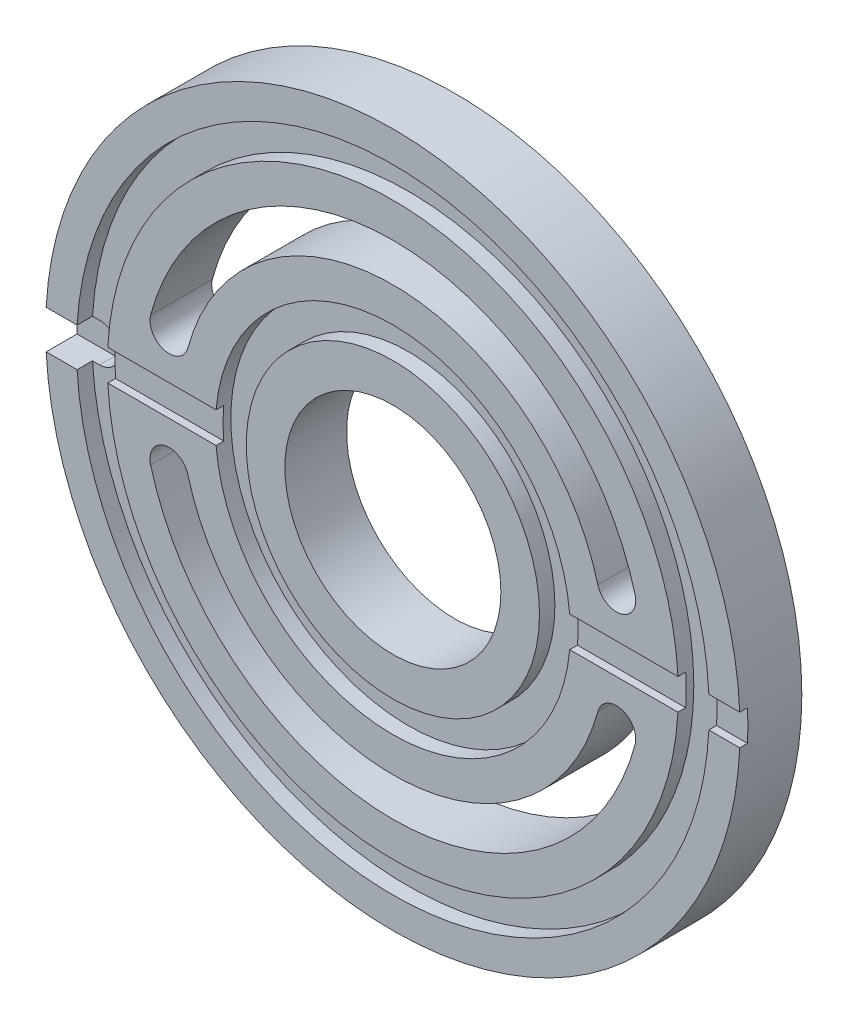
ISO-10303-21;
HEADER;
FILE_DESCRIPTION(('STEP AP214'),'2;1');
FILE_NAME('part.step','',(''),(''),'','','');
FILE_SCHEMA(('AUTOMOTIVE_DESIGN { 1 0 10303 214 1 1 1 1 }'));
ENDSEC;
DATA;
#1=APPLICATION_CONTEXT('core data for automotive mechanical design processes');
#2=APPLICATION_PROTOCOL_DEFINITION('international standard','automotive_design',2000,#1);
#3=PRODUCT_CONTEXT('',#1,'mechanical');
#4=PRODUCT('Part','Part','',(#3));
#5=PRODUCT_RELATED_PRODUCT_CATEGORY('part','',(#4));
#6=PRODUCT_DEFINITION_FORMATION('','',#4);
#7=PRODUCT_DEFINITION_CONTEXT('part definition',#1,'design');
#8=PRODUCT_DEFINITION('design','',#6,#7);
#9=PRODUCT_DEFINITION_SHAPE('','',#8);
#10=(LENGTH_UNIT() NAMED_UNIT(*) SI_UNIT(.MILLI.,.METRE.));
#11=(NAMED_UNIT(*) PLANE_ANGLE_UNIT() SI_UNIT($,.RADIAN.));
#12=(NAMED_UNIT(*) SI_UNIT($,.STERADIAN.) SOLID_ANGLE_UNIT());
#13=UNCERTAINTY_MEASURE_WITH_UNIT(LENGTH_MEASURE(1.E-05),#10,'distance_accuracy_value','');
#14=(GEOMETRIC_REPRESENTATION_CONTEXT(3) GLOBAL_UNCERTAINTY_ASSIGNED_CONTEXT((#13)) GLOBAL_UNIT_ASSIGNED_CONTEXT((#10,
#11,#12)) REPRESENTATION_CONTEXT('',''));
#15=CARTESIAN_POINT('',(0.,0.,0.));
#16=DIRECTION('',(0.,0.,1.));
#17=DIRECTION('',(1.,0.,0.));
#18=AXIS2_PLACEMENT_3D('',#15,#16,#17);
#19=CARTESIAN_POINT('',(0.,0.,8.));
#20=DIRECTION('',(0.,0.,1.));
#21=DIRECTION('',(1.,0.,0.));
#22=AXIS2_PLACEMENT_3D('',#19,#20,#21);
#23=PLANE('',#22);
#24=CARTESIAN_POINT('',(0.,0.,8.));
#25=DIRECTION('',(0.,0.,1.));
#26=DIRECTION('',(1.,0.,0.));
#27=AXIS2_PLACEMENT_3D('',#24,#25,#26);
#28=CIRCLE('',#27,27.5);
#29=CARTESIAN_POINT('',(-26.5629602229494,-7.11752374031915,8.));
#30=VERTEX_POINT('',#29);
#31=CARTESIAN_POINT('',(26.5629602229494,-7.11752374031915,8.));
#32=VERTEX_POINT('',#31);
#33=EDGE_CURVE('E292',#30,#32,#28,.T.);
#34=ORIENTED_EDGE('',*,*,#33,.T.);
#35=CARTESIAN_POINT('',(28.9777747886721,-7.76457135307544,8.));
#36=DIRECTION('',(0.,0.,-1.));
#37=DIRECTION('',(-1.,0.,0.));
#38=AXIS2_PLACEMENT_3D('',#35,#36,#37);
#39=CIRCLE('',#38,2.5);
#40=CARTESIAN_POINT('',(31.3925893543948,-8.41161896583172,8.));
#41=VERTEX_POINT('',#40);
#42=EDGE_CURVE('E288',#32,#41,#39,.T.);
#43=ORIENTED_EDGE('',*,*,#42,.T.);
#44=CARTESIAN_POINT('',(0.,0.,8.));
#45=DIRECTION('',(0.,0.,-1.));
#46=DIRECTION('',(1.,0.,0.));
#47=AXIS2_PLACEMENT_3D('',#44,#45,#46);
#48=CIRCLE('',#47,32.5);
#49=CARTESIAN_POINT('',(-31.3925893543948,-8.41161896583172,8.));
#50=VERTEX_POINT('',#49);
#51=EDGE_CURVE('E277',#41,#50,#48,.T.);
#52=ORIENTED_EDGE('',*,*,#51,.T.);
#53=CARTESIAN_POINT('',(-28.9777747886721,-7.76457135307544,8.));
#54=DIRECTION('',(0.,0.,-1.));
#55=DIRECTION('',(1.,0.,0.));
#56=AXIS2_PLACEMENT_3D('',#53,#54,#55);
#57=CIRCLE('',#56,2.5);
#58=EDGE_CURVE('E296',#50,#30,#57,.T.);
#59=ORIENTED_EDGE('',*,*,#58,.T.);
#60=EDGE_LOOP('',(#34,#43,#52,#59));
#61=FACE_BOUND('',#60,.T.);
#62=CARTESIAN_POINT('',(0.,0.,8.));
#63=DIRECTION('',(0.,0.,1.));
#64=DIRECTION('',(1.,0.,0.));
#65=AXIS2_PLACEMENT_3D('',#62,#63,#64);
#66=CIRCLE('',#65,23.);
#67=CARTESIAN_POINT('',(-22.9128784747792,-2.,8.));
#68=VERTEX_POINT('',#67);
#69=CARTESIAN_POINT('',(22.9128784747792,-2.,8.));
#70=VERTEX_POINT('',#69);
#71=EDGE_CURVE('E249',#68,#70,#66,.T.);
#72=ORIENTED_EDGE('',*,*,#71,.F.);
#73=DIRECTION('',(1.,0.,0.));
#74=VECTOR('',#73,1.);
#75=CARTESIAN_POINT('',(-19.,-2.,8.));
#76=LINE('',#75,#74);
#77=CARTESIAN_POINT('',(-36.9459064038223,-2.,8.));
#78=VERTEX_POINT('',#77);
#79=EDGE_CURVE('E454',#68,#78,#76,.F.);
#80=ORIENTED_EDGE('',*,*,#79,.T.);
#81=CARTESIAN_POINT('',(0.,0.,8.));
#82=DIRECTION('',(0.,0.,1.));
#83=DIRECTION('',(1.,0.,0.));
#84=AXIS2_PLACEMENT_3D('',#81,#82,#83);
#85=CIRCLE('',#84,37.);
#86=CARTESIAN_POINT('',(36.9459064038223,-2.,8.));
#87=VERTEX_POINT('',#86);
#88=EDGE_CURVE('E251',#78,#87,#85,.T.);
#89=ORIENTED_EDGE('',*,*,#88,.T.);
#90=DIRECTION('',(1.,0.,0.));
#91=VECTOR('',#90,1.);
#92=CARTESIAN_POINT('',(19.,-2.,8.));
#93=LINE('',#92,#91);
#94=EDGE_CURVE('E235',#70,#87,#93,.T.);
#95=ORIENTED_EDGE('',*,*,#94,.F.);
#96=EDGE_LOOP('',(#72,#80,#89,#95));
#97=FACE_BOUND('',#96,.T.);
#98=ADVANCED_FACE('F58',(#61,#97),#23,.T.);
#99=CARTESIAN_POINT('',(0.,0.,8.));
#100=DIRECTION('',(0.,0.,1.));
#101=DIRECTION('',(1.,0.,0.));
#102=AXIS2_PLACEMENT_3D('',#99,#100,#101);
#103=CIRCLE('',#102,41.);
#104=CARTESIAN_POINT('',(40.9511904588865,2.,8.));
#105=VERTEX_POINT('',#104);
#106=CARTESIAN_POINT('',(-40.9237095092808,2.5,8.));
#107=VERTEX_POINT('',#106);
#108=EDGE_CURVE('E406',#105,#107,#103,.T.);
#109=ORIENTED_EDGE('',*,*,#108,.F.);
#110=DIRECTION('',(1.,0.,0.));
#111=VECTOR('',#110,1.);
#112=CARTESIAN_POINT('',(19.,2.,8.));
#113=LINE('',#112,#111);
#114=CARTESIAN_POINT('',(44.9555335859781,2.,8.));
#115=VERTEX_POINT('',#114);
#116=EDGE_CURVE('E253',#105,#115,#113,.T.);
#117=ORIENTED_EDGE('',*,*,#116,.T.);
#118=CARTESIAN_POINT('',(0.,0.,8.));
#119=DIRECTION('',(0.,0.,1.));
#120=DIRECTION('',(1.,0.,0.));
#121=AXIS2_PLACEMENT_3D('',#118,#119,#120);
#122=CIRCLE('',#121,45.);
#123=CARTESIAN_POINT('',(-44.9305018890286,2.5,8.));
#124=VERTEX_POINT('',#123);
#125=EDGE_CURVE('E433',#115,#124,#122,.T.);
#126=ORIENTED_EDGE('',*,*,#125,.T.);
#127=DIRECTION('',(-1.,0.,0.));
#128=VECTOR('',#127,1.);
#129=CARTESIAN_POINT('',(-45.,2.5,8.));
#130=LINE('',#129,#128);
#131=EDGE_CURVE('E365',#107,#124,#130,.T.);
#132=ORIENTED_EDGE('',*,*,#131,.F.);
#133=EDGE_LOOP('',(#109,#117,#126,#132));
#134=FACE_BOUND('',#133,.T.);
#135=ADVANCED_FACE('F521',(#134),#23,.T.);
#136=CARTESIAN_POINT('',(0.,0.,8.));
#137=DIRECTION('',(0.,0.,1.));
#138=DIRECTION('',(1.,0.,0.));
#139=AXIS2_PLACEMENT_3D('',#136,#137,#138);
#140=CIRCLE('',#139,14.);
#141=CARTESIAN_POINT('',(14.,0.,8.));
#142=VERTEX_POINT('',#141);
#143=EDGE_CURVE('E415',#142,#142,#140,.T.);
#144=ORIENTED_EDGE('',*,*,#143,.F.);
#145=EDGE_LOOP('',(#144));
#146=FACE_BOUND('',#145,.T.);
#147=CARTESIAN_POINT('',(0.,0.,8.));
#148=DIRECTION('',(0.,0.,1.));
#149=DIRECTION('',(1.,0.,0.));
#150=AXIS2_PLACEMENT_3D('',#147,#148,#149);
#151=CIRCLE('',#150,19.);
#152=CARTESIAN_POINT('',(19.,0.,8.));
#153=VERTEX_POINT('',#152);
#154=EDGE_CURVE('E268',#153,#153,#151,.T.);
#155=ORIENTED_EDGE('',*,*,#154,.T.);
#156=EDGE_LOOP('',(#155));
#157=FACE_BOUND('',#156,.T.);
#158=ADVANCED_FACE('F500',(#146,#157),#23,.T.);
#159=DIRECTION('',(1.,0.,0.));
#160=VECTOR('',#159,1.);
#161=CARTESIAN_POINT('',(-19.,2.,8.));
#162=LINE('',#161,#160);
#163=CARTESIAN_POINT('',(-22.9128784747792,2.,8.));
#164=VERTEX_POINT('',#163);
#165=CARTESIAN_POINT('',(-36.9459064038223,2.,8.));
#166=VERTEX_POINT('',#165);
#167=EDGE_CURVE('E555',#164,#166,#162,.F.);
#168=ORIENTED_EDGE('',*,*,#167,.F.);
#169=CARTESIAN_POINT('',(22.9128784747792,2.,8.));
#170=VERTEX_POINT('',#169);
#171=EDGE_CURVE('E261',#170,#164,#66,.T.);
#172=ORIENTED_EDGE('',*,*,#171,.F.);
#173=CARTESIAN_POINT('',(36.9459064038223,2.,8.));
#174=VERTEX_POINT('',#173);
#175=EDGE_CURVE('E628',#170,#174,#113,.T.);
#176=ORIENTED_EDGE('',*,*,#175,.T.);
#177=EDGE_CURVE('E407',#174,#166,#85,.T.);
#178=ORIENTED_EDGE('',*,*,#177,.T.);
#179=EDGE_LOOP('',(#168,#172,#176,#178));
#180=FACE_BOUND('',#179,.T.);
#181=CARTESIAN_POINT('',(28.9777747886721,7.76457135307544,8.));
#182=DIRECTION('',(0.,0.,1.));
#183=DIRECTION('',(-1.,0.,0.));
#184=AXIS2_PLACEMENT_3D('',#181,#182,#183);
#185=CIRCLE('',#184,2.5);
#186=CARTESIAN_POINT('',(26.5629602229494,7.11752374031915,8.));
#187=VERTEX_POINT('',#186);
#188=CARTESIAN_POINT('',(31.3925893543948,8.41161896583172,8.));
#189=VERTEX_POINT('',#188);
#190=EDGE_CURVE('E307',#187,#189,#185,.T.);
#191=ORIENTED_EDGE('',*,*,#190,.F.);
#192=CARTESIAN_POINT('',(0.,0.,8.));
#193=DIRECTION('',(0.,0.,-1.));
#194=DIRECTION('',(1.,0.,0.));
#195=AXIS2_PLACEMENT_3D('',#192,#193,#194);
#196=CIRCLE('',#195,27.5);
#197=CARTESIAN_POINT('',(-26.5629602229494,7.11752374031915,8.));
#198=VERTEX_POINT('',#197);
#199=EDGE_CURVE('E322',#198,#187,#196,.T.);
#200=ORIENTED_EDGE('',*,*,#199,.F.);
#201=CARTESIAN_POINT('',(-28.9777747886721,7.76457135307544,8.));
#202=DIRECTION('',(0.,0.,1.));
#203=DIRECTION('',(1.,0.,0.));
#204=AXIS2_PLACEMENT_3D('',#201,#202,#203);
#205=CIRCLE('',#204,2.5);
#206=CARTESIAN_POINT('',(-31.3925893543948,8.41161896583172,8.));
#207=VERTEX_POINT('',#206);
#208=EDGE_CURVE('E341',#207,#198,#205,.T.);
#209=ORIENTED_EDGE('',*,*,#208,.F.);
#210=CARTESIAN_POINT('',(0.,0.,8.));
#211=DIRECTION('',(0.,0.,1.));
#212=DIRECTION('',(1.,0.,0.));
#213=AXIS2_PLACEMENT_3D('',#210,#211,#212);
#214=CIRCLE('',#213,32.5);
#215=EDGE_CURVE('E337',#189,#207,#214,.T.);
#216=ORIENTED_EDGE('',*,*,#215,.F.);
#217=EDGE_LOOP('',(#191,#200,#209,#216));
#218=FACE_BOUND('',#217,.T.);
#219=ADVANCED_FACE('F533',(#180,#218),#23,.T.);
#220=CARTESIAN_POINT('',(0.,0.,0.));
#221=DIRECTION('',(0.,0.,1.));
#222=DIRECTION('',(1.,0.,0.));
#223=AXIS2_PLACEMENT_3D('',#220,#221,#222);
#224=PLANE('',#223);
#225=CARTESIAN_POINT('',(0.,0.,0.));
#226=DIRECTION('',(0.,0.,1.));
#227=DIRECTION('',(1.,0.,0.));
#228=AXIS2_PLACEMENT_3D('',#225,#226,#227);
#229=CIRCLE('',#228,45.);
#230=CARTESIAN_POINT('',(45.,0.,0.));
#231=VERTEX_POINT('',#230);
#232=EDGE_CURVE('E424',#231,#231,#229,.T.);
#233=ORIENTED_EDGE('',*,*,#232,.F.);
#234=EDGE_LOOP('',(#233));
#235=FACE_BOUND('',#234,.T.);
#236=CARTESIAN_POINT('',(0.,0.,0.));
#237=DIRECTION('',(0.,0.,1.));
#238=DIRECTION('',(1.,0.,0.));
#239=AXIS2_PLACEMENT_3D('',#236,#237,#238);
#240=CIRCLE('',#239,14.);
#241=CARTESIAN_POINT('',(14.,0.,0.));
#242=VERTEX_POINT('',#241);
#243=EDGE_CURVE('E420',#242,#242,#240,.T.);
#244=ORIENTED_EDGE('',*,*,#243,.T.);
#245=EDGE_LOOP('',(#244));
#246=FACE_BOUND('',#245,.T.);
#247=CARTESIAN_POINT('',(0.,0.,0.));
#248=DIRECTION('',(0.,0.,-1.));
#249=DIRECTION('',(1.,0.,0.));
#250=AXIS2_PLACEMENT_3D('',#247,#248,#249);
#251=CIRCLE('',#250,27.5);
#252=CARTESIAN_POINT('',(-26.5629602229494,7.11752374031915,0.));
#253=VERTEX_POINT('',#252);
#254=CARTESIAN_POINT('',(26.5629602229494,7.11752374031915,0.));
#255=VERTEX_POINT('',#254);
#256=EDGE_CURVE('E330',#253,#255,#251,.T.);
#257=ORIENTED_EDGE('',*,*,#256,.T.);
#258=CARTESIAN_POINT('',(28.9777747886721,7.76457135307544,0.));
#259=DIRECTION('',(0.,0.,1.));
#260=DIRECTION('',(-1.,0.,0.));
#261=AXIS2_PLACEMENT_3D('',#258,#259,#260);
#262=CIRCLE('',#261,2.5);
#263=CARTESIAN_POINT('',(31.3925893543948,8.41161896583172,0.));
#264=VERTEX_POINT('',#263);
#265=EDGE_CURVE('E317',#255,#264,#262,.T.);
#266=ORIENTED_EDGE('',*,*,#265,.T.);
#267=CARTESIAN_POINT('',(0.,0.,0.));
#268=DIRECTION('',(0.,0.,1.));
#269=DIRECTION('',(1.,0.,0.));
#270=AXIS2_PLACEMENT_3D('',#267,#268,#269);
#271=CIRCLE('',#270,32.5);
#272=CARTESIAN_POINT('',(-31.3925893543948,8.41161896583172,0.));
#273=VERTEX_POINT('',#272);
#274=EDGE_CURVE('E321',#264,#273,#271,.T.);
#275=ORIENTED_EDGE('',*,*,#274,.T.);
#276=CARTESIAN_POINT('',(-28.9777747886721,7.76457135307544,0.));
#277=DIRECTION('',(0.,0.,1.));
#278=DIRECTION('',(1.,0.,0.));
#279=AXIS2_PLACEMENT_3D('',#276,#277,#278);
#280=CIRCLE('',#279,2.5);
#281=EDGE_CURVE('E326',#273,#253,#280,.T.);
#282=ORIENTED_EDGE('',*,*,#281,.T.);
#283=EDGE_LOOP('',(#257,#266,#275,#282));
#284=FACE_BOUND('',#283,.T.);
#285=CARTESIAN_POINT('',(28.9777747886721,-7.76457135307544,0.));
#286=DIRECTION('',(0.,0.,-1.));
#287=DIRECTION('',(-1.,0.,0.));
#288=AXIS2_PLACEMENT_3D('',#285,#286,#287);
#289=CIRCLE('',#288,2.5);
#290=CARTESIAN_POINT('',(26.5629602229494,-7.11752374031915,0.));
#291=VERTEX_POINT('',#290);
#292=CARTESIAN_POINT('',(31.3925893543948,-8.41161896583172,0.));
#293=VERTEX_POINT('',#292);
#294=EDGE_CURVE('E273',#291,#293,#289,.T.);
#295=ORIENTED_EDGE('',*,*,#294,.F.);
#296=CARTESIAN_POINT('',(0.,0.,0.));
#297=DIRECTION('',(0.,0.,1.));
#298=DIRECTION('',(1.,0.,0.));
#299=AXIS2_PLACEMENT_3D('',#296,#297,#298);
#300=CIRCLE('',#299,27.5);
#301=CARTESIAN_POINT('',(-26.5629602229494,-7.11752374031915,0.));
#302=VERTEX_POINT('',#301);
#303=EDGE_CURVE('E276',#302,#291,#300,.T.);
#304=ORIENTED_EDGE('',*,*,#303,.F.);
#305=CARTESIAN_POINT('',(-28.9777747886721,-7.76457135307544,0.));
#306=DIRECTION('',(0.,0.,-1.));
#307=DIRECTION('',(1.,0.,0.));
#308=AXIS2_PLACEMENT_3D('',#305,#306,#307);
#309=CIRCLE('',#308,2.5);
#310=CARTESIAN_POINT('',(-31.3925893543948,-8.41161896583172,0.));
#311=VERTEX_POINT('',#310);
#312=EDGE_CURVE('E280',#311,#302,#309,.T.);
#313=ORIENTED_EDGE('',*,*,#312,.F.);
#314=CARTESIAN_POINT('',(0.,0.,0.));
#315=DIRECTION('',(0.,0.,-1.));
#316=DIRECTION('',(1.,0.,0.));
#317=AXIS2_PLACEMENT_3D('',#314,#315,#316);
#318=CIRCLE('',#317,32.5);
#319=EDGE_CURVE('E284',#293,#311,#318,.T.);
#320=ORIENTED_EDGE('',*,*,#319,.F.);
#321=EDGE_LOOP('',(#295,#304,#313,#320));
#322=FACE_BOUND('',#321,.T.);
#323=ADVANCED_FACE('F541',(#235,#246,#284,#322),#224,.F.);
#324=CARTESIAN_POINT('',(0.,0.,8.));
#325=DIRECTION('',(0.,0.,-1.));
#326=DIRECTION('',(-1.,0.,0.));
#327=AXIS2_PLACEMENT_3D('',#324,#325,#326);
#328=CYLINDRICAL_SURFACE('',#327,45.);
#329=CARTESIAN_POINT('',(0.,0.,7.));
#330=DIRECTION('',(0.,0.,-1.));
#331=DIRECTION('',(-1.,0.,0.));
#332=AXIS2_PLACEMENT_3D('',#329,#330,#331);
#333=CIRCLE('',#332,45.);
#334=CARTESIAN_POINT('',(44.9555335859781,2.,7.));
#335=VERTEX_POINT('',#334);
#336=CARTESIAN_POINT('',(44.9555335859781,-2.,7.));
#337=VERTEX_POINT('',#336);
#338=EDGE_CURVE('E460',#335,#337,#333,.T.);
#339=ORIENTED_EDGE('',*,*,#338,.T.);
#340=DIRECTION('',(0.,0.,-1.));
#341=VECTOR('',#340,1.);
#342=CARTESIAN_POINT('',(44.9555335859781,-2.,8.));
#343=LINE('',#342,#341);
#344=CARTESIAN_POINT('',(44.9555335859781,-2.,8.));
#345=VERTEX_POINT('',#344);
#346=EDGE_CURVE('E486',#337,#345,#343,.F.);
#347=ORIENTED_EDGE('',*,*,#346,.T.);
#348=CARTESIAN_POINT('',(-44.9305018890286,-2.5,8.));
#349=VERTEX_POINT('',#348);
#350=EDGE_CURVE('E428',#349,#345,#122,.T.);
#351=ORIENTED_EDGE('',*,*,#350,.F.);
#352=DIRECTION('',(0.,0.,-1.));
#353=VECTOR('',#352,1.);
#354=CARTESIAN_POINT('',(-44.9305018890286,-2.5,8.));
#355=LINE('',#354,#353);
#356=CARTESIAN_POINT('',(-44.9305018890286,-2.5,4.));
#357=VERTEX_POINT('',#356);
#358=EDGE_CURVE('E390',#349,#357,#355,.T.);
#359=ORIENTED_EDGE('',*,*,#358,.T.);
#360=CARTESIAN_POINT('',(0.,0.,4.));
#361=DIRECTION('',(0.,0.,1.));
#362=DIRECTION('',(1.,0.,0.));
#363=AXIS2_PLACEMENT_3D('',#360,#361,#362);
#364=CIRCLE('',#363,45.);
#365=CARTESIAN_POINT('',(-44.9305018890286,2.5,4.));
#366=VERTEX_POINT('',#365);
#367=EDGE_CURVE('E445',#366,#357,#364,.T.);
#368=ORIENTED_EDGE('',*,*,#367,.F.);
#369=DIRECTION('',(0.,0.,-1.));
#370=VECTOR('',#369,1.);
#371=CARTESIAN_POINT('',(-44.9305018890286,2.5,8.));
#372=LINE('',#371,#370);
#373=EDGE_CURVE('E398',#366,#124,#372,.F.);
#374=ORIENTED_EDGE('',*,*,#373,.T.);
#375=ORIENTED_EDGE('',*,*,#125,.F.);
#376=DIRECTION('',(0.,0.,-1.));
#377=VECTOR('',#376,1.);
#378=CARTESIAN_POINT('',(44.9555335859781,2.,8.));
#379=LINE('',#378,#377);
#380=EDGE_CURVE('E476',#335,#115,#379,.F.);
#381=ORIENTED_EDGE('',*,*,#380,.F.);
#382=EDGE_LOOP('',(#339,#347,#351,#359,#368,#374,#375,#381));
#383=FACE_BOUND('',#382,.T.);
#384=ORIENTED_EDGE('',*,*,#232,.T.);
#385=EDGE_LOOP('',(#384));
#386=FACE_BOUND('',#385,.T.);
#387=ADVANCED_FACE('F60',(#383,#386),#328,.T.);
#388=CARTESIAN_POINT('',(40.9511904588865,-2.,8.));
#389=VERTEX_POINT('',#388);
#390=EDGE_CURVE('E254',#389,#345,#93,.T.);
#391=ORIENTED_EDGE('',*,*,#390,.F.);
#392=CARTESIAN_POINT('',(-40.9237095092808,-2.5,8.));
#393=VERTEX_POINT('',#392);
#394=EDGE_CURVE('E416',#393,#389,#103,.T.);
#395=ORIENTED_EDGE('',*,*,#394,.F.);
#396=DIRECTION('',(1.,0.,0.));
#397=VECTOR('',#396,1.);
#398=CARTESIAN_POINT('',(-45.,-2.5,8.));
#399=LINE('',#398,#397);
#400=EDGE_CURVE('E351',#349,#393,#399,.T.);
#401=ORIENTED_EDGE('',*,*,#400,.F.);
#402=ORIENTED_EDGE('',*,*,#350,.T.);
#403=EDGE_LOOP('',(#391,#395,#401,#402));
#404=FACE_BOUND('',#403,.T.);
#405=ADVANCED_FACE('F524',(#404),#23,.T.);
#406=CARTESIAN_POINT('',(0.,0.,0.));
#407=DIRECTION('',(0.,0.,1.));
#408=DIRECTION('',(1.,0.,0.));
#409=AXIS2_PLACEMENT_3D('',#406,#407,#408);
#410=CYLINDRICAL_SURFACE('',#409,14.);
#411=ORIENTED_EDGE('',*,*,#243,.F.);
#412=EDGE_LOOP('',(#411));
#413=FACE_BOUND('',#412,.T.);
#414=ORIENTED_EDGE('',*,*,#143,.T.);
#415=EDGE_LOOP('',(#414));
#416=FACE_BOUND('',#415,.T.);
#417=ADVANCED_FACE('F531',(#413,#416),#410,.F.);
#418=CARTESIAN_POINT('',(0.,0.,6.));
#419=DIRECTION('',(0.,0.,1.));
#420=DIRECTION('',(1.,0.,0.));
#421=AXIS2_PLACEMENT_3D('',#418,#419,#420);
#422=CYLINDRICAL_SURFACE('',#421,41.);
#423=ORIENTED_EDGE('',*,*,#394,.T.);
#424=DIRECTION('',(0.,0.,1.));
#425=VECTOR('',#424,1.);
#426=CARTESIAN_POINT('',(40.9511904588865,-2.,6.));
#427=LINE('',#426,#425);
#428=CARTESIAN_POINT('',(40.9511904588865,-2.,7.));
#429=VERTEX_POINT('',#428);
#430=EDGE_CURVE('E482',#389,#429,#427,.F.);
#431=ORIENTED_EDGE('',*,*,#430,.T.);
#432=CARTESIAN_POINT('',(0.,0.,7.));
#433=DIRECTION('',(0.,0.,-1.));
#434=DIRECTION('',(-1.,0.,0.));
#435=AXIS2_PLACEMENT_3D('',#432,#433,#434);
#436=CIRCLE('',#435,41.);
#437=CARTESIAN_POINT('',(40.9511904588865,2.,7.));
#438=VERTEX_POINT('',#437);
#439=EDGE_CURVE('E466',#429,#438,#436,.F.);
#440=ORIENTED_EDGE('',*,*,#439,.T.);
#441=DIRECTION('',(0.,0.,1.));
#442=VECTOR('',#441,1.);
#443=CARTESIAN_POINT('',(40.9511904588865,2.,6.));
#444=LINE('',#443,#442);
#445=EDGE_CURVE('E473',#105,#438,#444,.F.);
#446=ORIENTED_EDGE('',*,*,#445,.F.);
#447=ORIENTED_EDGE('',*,*,#108,.T.);
#448=DIRECTION('',(0.,0.,1.));
#449=VECTOR('',#448,1.);
#450=CARTESIAN_POINT('',(-40.9237095092808,2.5,6.));
#451=LINE('',#450,#449);
#452=CARTESIAN_POINT('',(-40.9237095092808,2.5,6.));
#453=VERTEX_POINT('',#452);
#454=EDGE_CURVE('E394',#107,#453,#451,.F.);
#455=ORIENTED_EDGE('',*,*,#454,.T.);
#456=CARTESIAN_POINT('',(0.,0.,6.));
#457=DIRECTION('',(0.,0.,1.));
#458=DIRECTION('',(1.,0.,0.));
#459=AXIS2_PLACEMENT_3D('',#456,#457,#458);
#460=CIRCLE('',#459,41.);
#461=CARTESIAN_POINT('',(-40.9237095092808,-2.5,6.));
#462=VERTEX_POINT('',#461);
#463=EDGE_CURVE('E411',#462,#453,#460,.T.);
#464=ORIENTED_EDGE('',*,*,#463,.F.);
#465=DIRECTION('',(0.,0.,1.));
#466=VECTOR('',#465,1.);
#467=CARTESIAN_POINT('',(-40.9237095092808,-2.5,6.));
#468=LINE('',#467,#466);
#469=EDGE_CURVE('E383',#462,#393,#468,.T.);
#470=ORIENTED_EDGE('',*,*,#469,.T.);
#471=EDGE_LOOP('',(#423,#431,#440,#446,#447,#455,#464,#470));
#472=FACE_BOUND('',#471,.T.);
#473=ADVANCED_FACE('F539',(#472),#422,.F.);
#474=CARTESIAN_POINT('',(0.,0.,6.));
#475=DIRECTION('',(0.,0.,1.));
#476=DIRECTION('',(1.,0.,0.));
#477=AXIS2_PLACEMENT_3D('',#474,#475,#476);
#478=PLANE('',#477);
#479=DIRECTION('',(-1.,0.,0.));
#480=VECTOR('',#479,1.);
#481=CARTESIAN_POINT('',(0.,2.5,6.));
#482=LINE('',#481,#480);
#483=CARTESIAN_POINT('',(-40.,2.5,6.));
#484=VERTEX_POINT('',#483);
#485=EDGE_CURVE('E442',#484,#453,#482,.T.);
#486=ORIENTED_EDGE('',*,*,#485,.F.);
#487=CARTESIAN_POINT('',(-40.,0.,6.));
#488=DIRECTION('',(0.,0.,1.));
#489=DIRECTION('',(1.,0.,0.));
#490=AXIS2_PLACEMENT_3D('',#487,#488,#489);
#491=CIRCLE('',#490,2.5);
#492=CARTESIAN_POINT('',(-40.,-2.5,6.));
#493=VERTEX_POINT('',#492);
#494=EDGE_CURVE('E439',#493,#484,#491,.T.);
#495=ORIENTED_EDGE('',*,*,#494,.F.);
#496=DIRECTION('',(1.,0.,0.));
#497=VECTOR('',#496,1.);
#498=CARTESIAN_POINT('',(0.,-2.5,6.));
#499=LINE('',#498,#497);
#500=EDGE_CURVE('E432',#462,#493,#499,.T.);
#501=ORIENTED_EDGE('',*,*,#500,.F.);
#502=ORIENTED_EDGE('',*,*,#463,.T.);
#503=EDGE_LOOP('',(#486,#495,#501,#502));
#504=FACE_BOUND('',#503,.T.);
#505=CARTESIAN_POINT('',(0.,0.,6.));
#506=DIRECTION('',(0.,0.,1.));
#507=DIRECTION('',(1.,0.,0.));
#508=AXIS2_PLACEMENT_3D('',#505,#506,#507);
#509=CIRCLE('',#508,37.);
#510=CARTESIAN_POINT('',(37.,0.,6.));
#511=VERTEX_POINT('',#510);
#512=EDGE_CURVE('E402',#511,#511,#509,.T.);
#513=ORIENTED_EDGE('',*,*,#512,.F.);
#514=EDGE_LOOP('',(#513));
#515=FACE_BOUND('',#514,.T.);
#516=ADVANCED_FACE('F606',(#504,#515),#478,.T.);
#517=CARTESIAN_POINT('',(0.,0.,6.));
#518=DIRECTION('',(0.,0.,1.));
#519=DIRECTION('',(1.,0.,0.));
#520=AXIS2_PLACEMENT_3D('',#517,#518,#519);
#521=CYLINDRICAL_SURFACE('',#520,37.);
#522=DIRECTION('',(0.,0.,1.));
#523=VECTOR('',#522,1.);
#524=CARTESIAN_POINT('',(-36.9459064038223,2.,6.));
#525=LINE('',#524,#523);
#526=CARTESIAN_POINT('',(-36.9459064038223,2.,7.));
#527=VERTEX_POINT('',#526);
#528=EDGE_CURVE('E493',#166,#527,#525,.F.);
#529=ORIENTED_EDGE('',*,*,#528,.F.);
#530=ORIENTED_EDGE('',*,*,#177,.F.);
#531=DIRECTION('',(0.,0.,1.));
#532=VECTOR('',#531,1.);
#533=CARTESIAN_POINT('',(36.9459064038223,2.,6.));
#534=LINE('',#533,#532);
#535=CARTESIAN_POINT('',(36.9459064038223,2.,7.));
#536=VERTEX_POINT('',#535);
#537=EDGE_CURVE('E464',#174,#536,#534,.F.);
#538=ORIENTED_EDGE('',*,*,#537,.T.);
#539=CARTESIAN_POINT('',(0.,0.,7.));
#540=DIRECTION('',(0.,0.,-1.));
#541=DIRECTION('',(-1.,0.,0.));
#542=AXIS2_PLACEMENT_3D('',#539,#540,#541);
#543=CIRCLE('',#542,37.);
#544=CARTESIAN_POINT('',(36.9459064038223,-2.,7.));
#545=VERTEX_POINT('',#544);
#546=EDGE_CURVE('E632',#545,#536,#543,.F.);
#547=ORIENTED_EDGE('',*,*,#546,.F.);
#548=DIRECTION('',(0.,0.,1.));
#549=VECTOR('',#548,1.);
#550=CARTESIAN_POINT('',(36.9459064038223,-2.,6.));
#551=LINE('',#550,#549);
#552=EDGE_CURVE('E479',#87,#545,#551,.F.);
#553=ORIENTED_EDGE('',*,*,#552,.F.);
#554=ORIENTED_EDGE('',*,*,#88,.F.);
#555=DIRECTION('',(0.,0.,1.));
#556=VECTOR('',#555,1.);
#557=CARTESIAN_POINT('',(-36.9459064038223,-2.,6.));
#558=LINE('',#557,#556);
#559=CARTESIAN_POINT('',(-36.9459064038223,-2.,7.));
#560=VERTEX_POINT('',#559);
#561=EDGE_CURVE('E490',#78,#560,#558,.F.);
#562=ORIENTED_EDGE('',*,*,#561,.T.);
#563=CARTESIAN_POINT('',(0.,0.,7.));
#564=DIRECTION('',(0.,0.,1.));
#565=DIRECTION('',(1.,0.,0.));
#566=AXIS2_PLACEMENT_3D('',#563,#564,#565);
#567=CIRCLE('',#566,37.);
#568=EDGE_CURVE('E459',#560,#527,#567,.F.);
#569=ORIENTED_EDGE('',*,*,#568,.T.);
#570=EDGE_LOOP('',(#529,#530,#538,#547,#553,#554,#562,#569));
#571=FACE_BOUND('',#570,.T.);
#572=ORIENTED_EDGE('',*,*,#512,.T.);
#573=EDGE_LOOP('',(#572));
#574=FACE_BOUND('',#573,.T.);
#575=ADVANCED_FACE('F592',(#571,#574),#521,.T.);
#576=CARTESIAN_POINT('',(-45.,0.,4.));
#577=DIRECTION('',(0.,0.,1.));
#578=DIRECTION('',(1.,0.,0.));
#579=AXIS2_PLACEMENT_3D('',#576,#577,#578);
#580=PLANE('',#579);
#581=ORIENTED_EDGE('',*,*,#367,.T.);
#582=DIRECTION('',(1.,0.,0.));
#583=VECTOR('',#582,1.);
#584=CARTESIAN_POINT('',(-45.,-2.5,4.));
#585=LINE('',#584,#583);
#586=CARTESIAN_POINT('',(-40.,-2.5,4.));
#587=VERTEX_POINT('',#586);
#588=EDGE_CURVE('E361',#357,#587,#585,.T.);
#589=ORIENTED_EDGE('',*,*,#588,.T.);
#590=CARTESIAN_POINT('',(-40.,0.,4.));
#591=DIRECTION('',(0.,0.,1.));
#592=DIRECTION('',(1.,0.,0.));
#593=AXIS2_PLACEMENT_3D('',#590,#591,#592);
#594=CIRCLE('',#593,2.5);
#595=CARTESIAN_POINT('',(-40.,2.5,4.));
#596=VERTEX_POINT('',#595);
#597=EDGE_CURVE('E364',#587,#596,#594,.T.);
#598=ORIENTED_EDGE('',*,*,#597,.T.);
#599=DIRECTION('',(-1.,0.,0.));
#600=VECTOR('',#599,1.);
#601=CARTESIAN_POINT('',(-45.,2.5,4.));
#602=LINE('',#601,#600);
#603=EDGE_CURVE('E369',#596,#366,#602,.T.);
#604=ORIENTED_EDGE('',*,*,#603,.T.);
#605=EDGE_LOOP('',(#581,#589,#598,#604));
#606=FACE_BOUND('',#605,.T.);
#607=ADVANCED_FACE('F588',(#606),#580,.T.);
#608=CARTESIAN_POINT('',(-45.,2.5,4.));
#609=DIRECTION('',(0.,1.,0.));
#610=DIRECTION('',(0.,0.,1.));
#611=AXIS2_PLACEMENT_3D('',#608,#609,#610);
#612=PLANE('',#611);
#613=ORIENTED_EDGE('',*,*,#603,.F.);
#614=DIRECTION('',(0.,0.,1.));
#615=VECTOR('',#614,1.);
#616=CARTESIAN_POINT('',(-40.,2.5,4.));
#617=LINE('',#616,#615);
#618=EDGE_CURVE('E379',#596,#484,#617,.T.);
#619=ORIENTED_EDGE('',*,*,#618,.T.);
#620=ORIENTED_EDGE('',*,*,#485,.T.);
#621=ORIENTED_EDGE('',*,*,#454,.F.);
#622=ORIENTED_EDGE('',*,*,#131,.T.);
#623=ORIENTED_EDGE('',*,*,#373,.F.);
#624=EDGE_LOOP('',(#613,#619,#620,#621,#622,#623));
#625=FACE_BOUND('',#624,.T.);
#626=ADVANCED_FACE('F591',(#625),#612,.F.);
#627=CARTESIAN_POINT('',(-45.,-2.5,4.));
#628=DIRECTION('',(0.,-1.,0.));
#629=DIRECTION('',(0.,0.,-1.));
#630=AXIS2_PLACEMENT_3D('',#627,#628,#629);
#631=PLANE('',#630);
#632=ORIENTED_EDGE('',*,*,#400,.T.);
#633=ORIENTED_EDGE('',*,*,#469,.F.);
#634=ORIENTED_EDGE('',*,*,#500,.T.);
#635=DIRECTION('',(0.,0.,1.));
#636=VECTOR('',#635,1.);
#637=CARTESIAN_POINT('',(-40.,-2.5,4.));
#638=LINE('',#637,#636);
#639=EDGE_CURVE('E373',#587,#493,#638,.T.);
#640=ORIENTED_EDGE('',*,*,#639,.F.);
#641=ORIENTED_EDGE('',*,*,#588,.F.);
#642=ORIENTED_EDGE('',*,*,#358,.F.);
#643=EDGE_LOOP('',(#632,#633,#634,#640,#641,#642));
#644=FACE_BOUND('',#643,.T.);
#645=ADVANCED_FACE('F596',(#644),#631,.F.);
#646=CARTESIAN_POINT('',(-40.,0.,4.));
#647=DIRECTION('',(0.,0.,1.));
#648=DIRECTION('',(1.,0.,0.));
#649=AXIS2_PLACEMENT_3D('',#646,#647,#648);
#650=CYLINDRICAL_SURFACE('',#649,2.5);
#651=ORIENTED_EDGE('',*,*,#494,.T.);
#652=ORIENTED_EDGE('',*,*,#618,.F.);
#653=ORIENTED_EDGE('',*,*,#597,.F.);
#654=ORIENTED_EDGE('',*,*,#639,.T.);
#655=EDGE_LOOP('',(#651,#652,#653,#654));
#656=FACE_BOUND('',#655,.T.);
#657=ADVANCED_FACE('F587',(#656),#650,.F.);
#658=CARTESIAN_POINT('',(28.9777747886721,7.76457135307544,0.));
#659=DIRECTION('',(0.,0.,1.));
#660=DIRECTION('',(1.,0.,0.));
#661=AXIS2_PLACEMENT_3D('',#658,#659,#660);
#662=CYLINDRICAL_SURFACE('',#661,2.5);
#663=ORIENTED_EDGE('',*,*,#190,.T.);
#664=DIRECTION('',(0.,0.,1.));
#665=VECTOR('',#664,1.);
#666=CARTESIAN_POINT('',(31.3925893543948,8.41161896583172,0.));
#667=LINE('',#666,#665);
#668=EDGE_CURVE('E334',#264,#189,#667,.T.);
#669=ORIENTED_EDGE('',*,*,#668,.F.);
#670=ORIENTED_EDGE('',*,*,#265,.F.);
#671=DIRECTION('',(0.,0.,1.));
#672=VECTOR('',#671,1.);
#673=CARTESIAN_POINT('',(26.5629602229494,7.11752374031915,0.));
#674=LINE('',#673,#672);
#675=EDGE_CURVE('E348',#255,#187,#674,.T.);
#676=ORIENTED_EDGE('',*,*,#675,.T.);
#677=EDGE_LOOP('',(#663,#669,#670,#676));
#678=FACE_BOUND('',#677,.T.);
#679=ADVANCED_FACE('F561',(#678),#662,.F.);
#680=CARTESIAN_POINT('',(0.,0.,0.));
#681=DIRECTION('',(0.,0.,1.));
#682=DIRECTION('',(1.,0.,0.));
#683=AXIS2_PLACEMENT_3D('',#680,#681,#682);
#684=CYLINDRICAL_SURFACE('',#683,27.5);
#685=ORIENTED_EDGE('',*,*,#199,.T.);
#686=ORIENTED_EDGE('',*,*,#675,.F.);
#687=ORIENTED_EDGE('',*,*,#256,.F.);
#688=DIRECTION('',(0.,0.,1.));
#689=VECTOR('',#688,1.);
#690=CARTESIAN_POINT('',(-26.5629602229494,7.11752374031915,0.));
#691=LINE('',#690,#689);
#692=EDGE_CURVE('E352',#253,#198,#691,.T.);
#693=ORIENTED_EDGE('',*,*,#692,.T.);
#694=EDGE_LOOP('',(#685,#686,#687,#693));
#695=FACE_BOUND('',#694,.T.);
#696=ADVANCED_FACE('F571',(#695),#684,.T.);
#697=CARTESIAN_POINT('',(-28.9777747886721,7.76457135307544,0.));
#698=DIRECTION('',(0.,0.,1.));
#699=DIRECTION('',(1.,0.,0.));
#700=AXIS2_PLACEMENT_3D('',#697,#698,#699);
#701=CYLINDRICAL_SURFACE('',#700,2.5);
#702=ORIENTED_EDGE('',*,*,#208,.T.);
#703=ORIENTED_EDGE('',*,*,#692,.F.);
#704=ORIENTED_EDGE('',*,*,#281,.F.);
#705=DIRECTION('',(0.,0.,1.));
#706=VECTOR('',#705,1.);
#707=CARTESIAN_POINT('',(-31.3925893543948,8.41161896583172,0.));
#708=LINE('',#707,#706);
#709=EDGE_CURVE('E355',#273,#207,#708,.T.);
#710=ORIENTED_EDGE('',*,*,#709,.T.);
#711=EDGE_LOOP('',(#702,#703,#704,#710));
#712=FACE_BOUND('',#711,.T.);
#713=ADVANCED_FACE('F573',(#712),#701,.F.);
#714=CARTESIAN_POINT('',(0.,0.,0.));
#715=DIRECTION('',(0.,0.,1.));
#716=DIRECTION('',(1.,0.,0.));
#717=AXIS2_PLACEMENT_3D('',#714,#715,#716);
#718=CYLINDRICAL_SURFACE('',#717,32.5);
#719=ORIENTED_EDGE('',*,*,#215,.T.);
#720=ORIENTED_EDGE('',*,*,#709,.F.);
#721=ORIENTED_EDGE('',*,*,#274,.F.);
#722=ORIENTED_EDGE('',*,*,#668,.T.);
#723=EDGE_LOOP('',(#719,#720,#721,#722));
#724=FACE_BOUND('',#723,.T.);
#725=ADVANCED_FACE('F565',(#724),#718,.F.);
#726=CARTESIAN_POINT('',(28.9777747886721,-7.76457135307544,0.));
#727=DIRECTION('',(0.,0.,1.));
#728=DIRECTION('',(1.,0.,0.));
#729=AXIS2_PLACEMENT_3D('',#726,#727,#728);
#730=CYLINDRICAL_SURFACE('',#729,2.5);
#731=ORIENTED_EDGE('',*,*,#42,.F.);
#732=DIRECTION('',(0.,0.,1.));
#733=VECTOR('',#732,1.);
#734=CARTESIAN_POINT('',(26.5629602229494,-7.11752374031915,0.));
#735=LINE('',#734,#733);
#736=EDGE_CURVE('E287',#291,#32,#735,.T.);
#737=ORIENTED_EDGE('',*,*,#736,.F.);
#738=ORIENTED_EDGE('',*,*,#294,.T.);
#739=DIRECTION('',(0.,0.,1.));
#740=VECTOR('',#739,1.);
#741=CARTESIAN_POINT('',(31.3925893543948,-8.41161896583172,0.));
#742=LINE('',#741,#740);
#743=EDGE_CURVE('E303',#293,#41,#742,.T.);
#744=ORIENTED_EDGE('',*,*,#743,.T.);
#745=EDGE_LOOP('',(#731,#737,#738,#744));
#746=FACE_BOUND('',#745,.T.);
#747=ADVANCED_FACE('F580',(#746),#730,.F.);
#748=CARTESIAN_POINT('',(0.,0.,0.));
#749=DIRECTION('',(0.,0.,1.));
#750=DIRECTION('',(1.,0.,0.));
#751=AXIS2_PLACEMENT_3D('',#748,#749,#750);
#752=CYLINDRICAL_SURFACE('',#751,32.5);
#753=ORIENTED_EDGE('',*,*,#51,.F.);
#754=ORIENTED_EDGE('',*,*,#743,.F.);
#755=ORIENTED_EDGE('',*,*,#319,.T.);
#756=DIRECTION('',(0.,0.,1.));
#757=VECTOR('',#756,1.);
#758=CARTESIAN_POINT('',(-31.3925893543948,-8.41161896583172,0.));
#759=LINE('',#758,#757);
#760=EDGE_CURVE('E308',#311,#50,#759,.T.);
#761=ORIENTED_EDGE('',*,*,#760,.T.);
#762=EDGE_LOOP('',(#753,#754,#755,#761));
#763=FACE_BOUND('',#762,.T.);
#764=ADVANCED_FACE('F691',(#763),#752,.F.);
#765=CARTESIAN_POINT('',(-28.9777747886721,-7.76457135307544,0.));
#766=DIRECTION('',(0.,0.,1.));
#767=DIRECTION('',(1.,0.,0.));
#768=AXIS2_PLACEMENT_3D('',#765,#766,#767);
#769=CYLINDRICAL_SURFACE('',#768,2.5);
#770=ORIENTED_EDGE('',*,*,#58,.F.);
#771=ORIENTED_EDGE('',*,*,#760,.F.);
#772=ORIENTED_EDGE('',*,*,#312,.T.);
#773=DIRECTION('',(0.,0.,1.));
#774=VECTOR('',#773,1.);
#775=CARTESIAN_POINT('',(-26.5629602229494,-7.11752374031915,0.));
#776=LINE('',#775,#774);
#777=EDGE_CURVE('E311',#302,#30,#776,.T.);
#778=ORIENTED_EDGE('',*,*,#777,.T.);
#779=EDGE_LOOP('',(#770,#771,#772,#778));
#780=FACE_BOUND('',#779,.T.);
#781=ADVANCED_FACE('F687',(#780),#769,.F.);
#782=CARTESIAN_POINT('',(0.,0.,0.));
#783=DIRECTION('',(0.,0.,1.));
#784=DIRECTION('',(1.,0.,0.));
#785=AXIS2_PLACEMENT_3D('',#782,#783,#784);
#786=CYLINDRICAL_SURFACE('',#785,27.5);
#787=ORIENTED_EDGE('',*,*,#33,.F.);
#788=ORIENTED_EDGE('',*,*,#777,.F.);
#789=ORIENTED_EDGE('',*,*,#303,.T.);
#790=ORIENTED_EDGE('',*,*,#736,.T.);
#791=EDGE_LOOP('',(#787,#788,#789,#790));
#792=FACE_BOUND('',#791,.T.);
#793=ADVANCED_FACE('F682',(#792),#786,.T.);
#794=CARTESIAN_POINT('',(0.,0.,6.));
#795=DIRECTION('',(0.,0.,1.));
#796=DIRECTION('',(1.,0.,0.));
#797=AXIS2_PLACEMENT_3D('',#794,#795,#796);
#798=CYLINDRICAL_SURFACE('',#797,23.);
#799=CARTESIAN_POINT('',(0.,0.,6.));
#800=DIRECTION('',(0.,0.,1.));
#801=DIRECTION('',(1.,0.,0.));
#802=AXIS2_PLACEMENT_3D('',#799,#800,#801);
#803=CIRCLE('',#802,23.);
#804=CARTESIAN_POINT('',(23.,0.,6.));
#805=VERTEX_POINT('',#804);
#806=EDGE_CURVE('E266',#805,#805,#803,.T.);
#807=ORIENTED_EDGE('',*,*,#806,.F.);
#808=EDGE_LOOP('',(#807));
#809=FACE_BOUND('',#808,.T.);
#810=ORIENTED_EDGE('',*,*,#171,.T.);
#811=DIRECTION('',(0.,0.,1.));
#812=VECTOR('',#811,1.);
#813=CARTESIAN_POINT('',(-22.9128784747792,2.,6.));
#814=LINE('',#813,#812);
#815=CARTESIAN_POINT('',(-22.9128784747792,2.,7.));
#816=VERTEX_POINT('',#815);
#817=EDGE_CURVE('E12',#164,#816,#814,.F.);
#818=ORIENTED_EDGE('',*,*,#817,.T.);
#819=CARTESIAN_POINT('',(0.,0.,7.));
#820=DIRECTION('',(0.,0.,1.));
#821=DIRECTION('',(1.,0.,0.));
#822=AXIS2_PLACEMENT_3D('',#819,#820,#821);
#823=CIRCLE('',#822,23.);
#824=CARTESIAN_POINT('',(-22.9128784747792,-2.,7.));
#825=VERTEX_POINT('',#824);
#826=EDGE_CURVE('E455',#825,#816,#823,.F.);
#827=ORIENTED_EDGE('',*,*,#826,.F.);
#828=DIRECTION('',(0.,0.,1.));
#829=VECTOR('',#828,1.);
#830=CARTESIAN_POINT('',(-22.9128784747792,-2.,6.));
#831=LINE('',#830,#829);
#832=EDGE_CURVE('E67',#68,#825,#831,.F.);
#833=ORIENTED_EDGE('',*,*,#832,.F.);
#834=ORIENTED_EDGE('',*,*,#71,.T.);
#835=DIRECTION('',(0.,0.,1.));
#836=VECTOR('',#835,1.);
#837=CARTESIAN_POINT('',(22.9128784747792,-2.,6.));
#838=LINE('',#837,#836);
#839=CARTESIAN_POINT('',(22.9128784747792,-2.,7.));
#840=VERTEX_POINT('',#839);
#841=EDGE_CURVE('E232',#70,#840,#838,.F.);
#842=ORIENTED_EDGE('',*,*,#841,.T.);
#843=CARTESIAN_POINT('',(0.,0.,7.));
#844=DIRECTION('',(0.,0.,-1.));
#845=DIRECTION('',(-1.,0.,0.));
#846=AXIS2_PLACEMENT_3D('',#843,#844,#845);
#847=CIRCLE('',#846,23.);
#848=CARTESIAN_POINT('',(22.9128784747792,2.,7.));
#849=VERTEX_POINT('',#848);
#850=EDGE_CURVE('E629',#840,#849,#847,.F.);
#851=ORIENTED_EDGE('',*,*,#850,.T.);
#852=DIRECTION('',(0.,0.,1.));
#853=VECTOR('',#852,1.);
#854=CARTESIAN_POINT('',(22.9128784747792,2.,6.));
#855=LINE('',#854,#853);
#856=EDGE_CURVE('E243',#170,#849,#855,.F.);
#857=ORIENTED_EDGE('',*,*,#856,.F.);
#858=EDGE_LOOP('',(#810,#818,#827,#833,#834,#842,#851,#857));
#859=FACE_BOUND('',#858,.T.);
#860=ADVANCED_FACE('F258',(#809,#859),#798,.F.);
#861=CARTESIAN_POINT('',(0.,0.,6.));
#862=DIRECTION('',(0.,0.,1.));
#863=DIRECTION('',(1.,0.,0.));
#864=AXIS2_PLACEMENT_3D('',#861,#862,#863);
#865=PLANE('',#864);
#866=CARTESIAN_POINT('',(0.,0.,6.));
#867=DIRECTION('',(0.,0.,1.));
#868=DIRECTION('',(1.,0.,0.));
#869=AXIS2_PLACEMENT_3D('',#866,#867,#868);
#870=CIRCLE('',#869,19.);
#871=CARTESIAN_POINT('',(19.,0.,6.));
#872=VERTEX_POINT('',#871);
#873=EDGE_CURVE('E262',#872,#872,#870,.T.);
#874=ORIENTED_EDGE('',*,*,#873,.F.);
#875=EDGE_LOOP('',(#874));
#876=FACE_BOUND('',#875,.T.);
#877=ORIENTED_EDGE('',*,*,#806,.T.);
#878=EDGE_LOOP('',(#877));
#879=FACE_BOUND('',#878,.T.);
#880=ADVANCED_FACE('F505',(#876,#879),#865,.T.);
#881=CARTESIAN_POINT('',(0.,0.,6.));
#882=DIRECTION('',(0.,0.,1.));
#883=DIRECTION('',(1.,0.,0.));
#884=AXIS2_PLACEMENT_3D('',#881,#882,#883);
#885=CYLINDRICAL_SURFACE('',#884,19.);
#886=ORIENTED_EDGE('',*,*,#873,.T.);
#887=EDGE_LOOP('',(#886));
#888=FACE_BOUND('',#887,.T.);
#889=ORIENTED_EDGE('',*,*,#154,.F.);
#890=EDGE_LOOP('',(#889));
#891=FACE_BOUND('',#890,.T.);
#892=ADVANCED_FACE('F502',(#888,#891),#885,.T.);
#893=CARTESIAN_POINT('',(0.,0.,7.));
#894=DIRECTION('',(0.,0.,-1.));
#895=DIRECTION('',(-1.,0.,0.));
#896=AXIS2_PLACEMENT_3D('',#893,#894,#895);
#897=PLANE('',#896);
#898=ORIENTED_EDGE('',*,*,#546,.T.);
#899=DIRECTION('',(1.,0.,0.));
#900=VECTOR('',#899,1.);
#901=CARTESIAN_POINT('',(19.,2.,7.));
#902=LINE('',#901,#900);
#903=EDGE_CURVE('E651',#849,#536,#902,.T.);
#904=ORIENTED_EDGE('',*,*,#903,.F.);
#905=ORIENTED_EDGE('',*,*,#850,.F.);
#906=DIRECTION('',(1.,0.,0.));
#907=VECTOR('',#906,1.);
#908=CARTESIAN_POINT('',(19.,-2.,7.));
#909=LINE('',#908,#907);
#910=EDGE_CURVE('E238',#840,#545,#909,.T.);
#911=ORIENTED_EDGE('',*,*,#910,.T.);
#912=EDGE_LOOP('',(#898,#904,#905,#911));
#913=FACE_BOUND('',#912,.T.);
#914=ADVANCED_FACE('F504',(#913),#897,.F.);
#915=CARTESIAN_POINT('',(19.,2.,7.));
#916=DIRECTION('',(0.,-1.,0.));
#917=DIRECTION('',(0.,0.,-1.));
#918=AXIS2_PLACEMENT_3D('',#915,#916,#917);
#919=PLANE('',#918);
#920=ORIENTED_EDGE('',*,*,#175,.F.);
#921=ORIENTED_EDGE('',*,*,#856,.T.);
#922=ORIENTED_EDGE('',*,*,#903,.T.);
#923=ORIENTED_EDGE('',*,*,#537,.F.);
#924=EDGE_LOOP('',(#920,#921,#922,#923));
#925=FACE_BOUND('',#924,.T.);
#926=ADVANCED_FACE('F512',(#925),#919,.T.);
#927=CARTESIAN_POINT('',(19.,-2.,7.));
#928=DIRECTION('',(0.,-1.,0.));
#929=DIRECTION('',(0.,0.,-1.));
#930=AXIS2_PLACEMENT_3D('',#927,#928,#929);
#931=PLANE('',#930);
#932=ORIENTED_EDGE('',*,*,#552,.T.);
#933=ORIENTED_EDGE('',*,*,#910,.F.);
#934=ORIENTED_EDGE('',*,*,#841,.F.);
#935=ORIENTED_EDGE('',*,*,#94,.T.);
#936=EDGE_LOOP('',(#932,#933,#934,#935));
#937=FACE_BOUND('',#936,.T.);
#938=ADVANCED_FACE('F234',(#937),#931,.F.);
#939=CARTESIAN_POINT('',(-19.,2.,7.));
#940=DIRECTION('',(0.,1.,0.));
#941=DIRECTION('',(0.,0.,1.));
#942=AXIS2_PLACEMENT_3D('',#939,#940,#941);
#943=PLANE('',#942);
#944=ORIENTED_EDGE('',*,*,#528,.T.);
#945=DIRECTION('',(1.,0.,0.));
#946=VECTOR('',#945,1.);
#947=CARTESIAN_POINT('',(-19.,2.,7.));
#948=LINE('',#947,#946);
#949=EDGE_CURVE('E648',#816,#527,#948,.F.);
#950=ORIENTED_EDGE('',*,*,#949,.F.);
#951=ORIENTED_EDGE('',*,*,#817,.F.);
#952=ORIENTED_EDGE('',*,*,#167,.T.);
#953=EDGE_LOOP('',(#944,#950,#951,#952));
#954=FACE_BOUND('',#953,.T.);
#955=ADVANCED_FACE('F657',(#954),#943,.F.);
#956=CARTESIAN_POINT('',(-19.,-2.,7.));
#957=DIRECTION('',(0.,1.,0.));
#958=DIRECTION('',(0.,0.,1.));
#959=AXIS2_PLACEMENT_3D('',#956,#957,#958);
#960=PLANE('',#959);
#961=ORIENTED_EDGE('',*,*,#79,.F.);
#962=ORIENTED_EDGE('',*,*,#832,.T.);
#963=DIRECTION('',(1.,0.,0.));
#964=VECTOR('',#963,1.);
#965=CARTESIAN_POINT('',(-19.,-2.,7.));
#966=LINE('',#965,#964);
#967=EDGE_CURVE('E82',#825,#560,#966,.F.);
#968=ORIENTED_EDGE('',*,*,#967,.T.);
#969=ORIENTED_EDGE('',*,*,#561,.F.);
#970=EDGE_LOOP('',(#961,#962,#968,#969));
#971=FACE_BOUND('',#970,.T.);
#972=ADVANCED_FACE('F452',(#971),#960,.T.);
#973=CARTESIAN_POINT('',(0.,0.,7.));
#974=DIRECTION('',(0.,0.,1.));
#975=DIRECTION('',(1.,0.,0.));
#976=AXIS2_PLACEMENT_3D('',#973,#974,#975);
#977=PLANE('',#976);
#978=ORIENTED_EDGE('',*,*,#967,.F.);
#979=ORIENTED_EDGE('',*,*,#826,.T.);
#980=ORIENTED_EDGE('',*,*,#949,.T.);
#981=ORIENTED_EDGE('',*,*,#568,.F.);
#982=EDGE_LOOP('',(#978,#979,#980,#981));
#983=FACE_BOUND('',#982,.T.);
#984=ADVANCED_FACE('F655',(#983),#977,.T.);
#985=EDGE_CURVE('E639',#429,#337,#909,.T.);
#986=ORIENTED_EDGE('',*,*,#985,.F.);
#987=ORIENTED_EDGE('',*,*,#430,.F.);
#988=ORIENTED_EDGE('',*,*,#390,.T.);
#989=ORIENTED_EDGE('',*,*,#346,.F.);
#990=EDGE_LOOP('',(#986,#987,#988,#989));
#991=FACE_BOUND('',#990,.T.);
#992=ADVANCED_FACE('F640',(#991),#931,.F.);
#993=ORIENTED_EDGE('',*,*,#380,.T.);
#994=ORIENTED_EDGE('',*,*,#116,.F.);
#995=ORIENTED_EDGE('',*,*,#445,.T.);
#996=EDGE_CURVE('E74',#438,#335,#902,.T.);
#997=ORIENTED_EDGE('',*,*,#996,.T.);
#998=EDGE_LOOP('',(#993,#994,#995,#997));
#999=FACE_BOUND('',#998,.T.);
#1000=ADVANCED_FACE('F669',(#999),#919,.T.);
#1001=ORIENTED_EDGE('',*,*,#996,.F.);
#1002=ORIENTED_EDGE('',*,*,#439,.F.);
#1003=ORIENTED_EDGE('',*,*,#985,.T.);
#1004=ORIENTED_EDGE('',*,*,#338,.F.);
#1005=EDGE_LOOP('',(#1001,#1002,#1003,#1004));
#1006=FACE_BOUND('',#1005,.T.);
#1007=ADVANCED_FACE('F515',(#1006),#897,.F.);
#1008=CLOSED_SHELL('',(#98,#135,#158,#219,#323,#387,#405,#417,#473,#516,#575,#607,#626,#645,
#657,#679,#696,#713,#725,#747,#764,#781,#793,#860,#880,#892,#914,#926,#938,#955,#972,#984,#992,
#1000,#1007));
#1009=MANIFOLD_SOLID_BREP('B2',#1008);
#1010=ADVANCED_BREP_SHAPE_REPRESENTATION('',(#18,#1009),#14);
#1011=SHAPE_DEFINITION_REPRESENTATION(#9,#1010);
ENDSEC;
END-ISO-10303-21;
